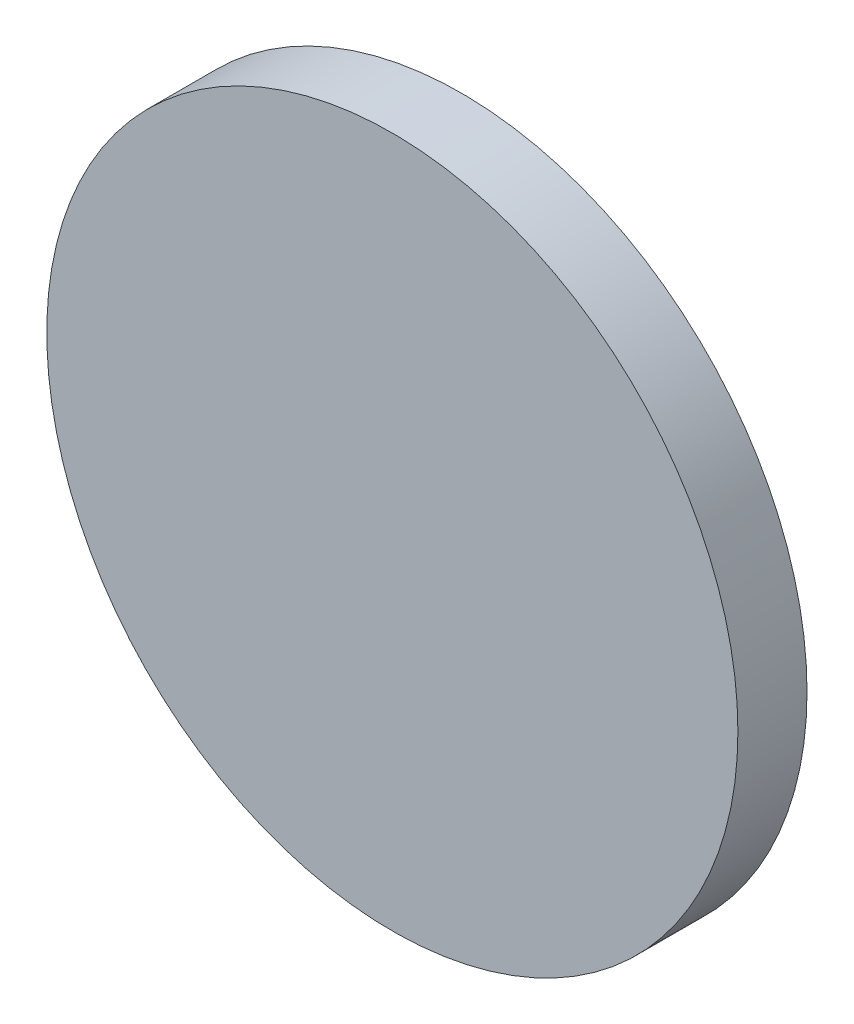
ISO-10303-21;
HEADER;
FILE_DESCRIPTION(('STEP AP214'),'2;1');
FILE_NAME('part.step','',(''),(''),'','','');
FILE_SCHEMA(('AUTOMOTIVE_DESIGN { 1 0 10303 214 1 1 1 1 }'));
ENDSEC;
DATA;
#1=APPLICATION_CONTEXT('core data for automotive mechanical design processes');
#2=APPLICATION_PROTOCOL_DEFINITION('international standard','automotive_design',2000,#1);
#3=PRODUCT_CONTEXT('',#1,'mechanical');
#4=PRODUCT('Part','Part','',(#3));
#5=PRODUCT_RELATED_PRODUCT_CATEGORY('part','',(#4));
#6=PRODUCT_DEFINITION_FORMATION('','',#4);
#7=PRODUCT_DEFINITION_CONTEXT('part definition',#1,'design');
#8=PRODUCT_DEFINITION('design','',#6,#7);
#9=PRODUCT_DEFINITION_SHAPE('','',#8);
#10=(LENGTH_UNIT() NAMED_UNIT(*) SI_UNIT(.MILLI.,.METRE.));
#11=(NAMED_UNIT(*) PLANE_ANGLE_UNIT() SI_UNIT($,.RADIAN.));
#12=(NAMED_UNIT(*) SI_UNIT($,.STERADIAN.) SOLID_ANGLE_UNIT());
#13=UNCERTAINTY_MEASURE_WITH_UNIT(LENGTH_MEASURE(1.E-05),#10,'distance_accuracy_value','');
#14=(GEOMETRIC_REPRESENTATION_CONTEXT(3) GLOBAL_UNCERTAINTY_ASSIGNED_CONTEXT((#13)) GLOBAL_UNIT_ASSIGNED_CONTEXT((#10,
#11,#12)) REPRESENTATION_CONTEXT('',''));
#15=CARTESIAN_POINT('',(0.,0.,0.));
#16=DIRECTION('',(0.,0.,1.));
#17=DIRECTION('',(1.,0.,0.));
#18=AXIS2_PLACEMENT_3D('',#15,#16,#17);
#19=CARTESIAN_POINT('',(-0.860205171589579,39.9907495186422,3.));
#20=DIRECTION('',(0.,0.,1.));
#21=DIRECTION('',(1.,0.,0.));
#22=AXIS2_PLACEMENT_3D('',#19,#20,#21);
#23=PLANE('',#22);
#24=CARTESIAN_POINT('',(-0.860205171589579,39.9907495186422,3.));
#25=DIRECTION('',(0.,0.,1.));
#26=DIRECTION('',(1.,0.,0.));
#27=AXIS2_PLACEMENT_3D('',#24,#25,#26);
#28=CIRCLE('',#27,15.);
#29=CARTESIAN_POINT('',(14.1397948284104,39.9907495186422,3.));
#30=VERTEX_POINT('',#29);
#31=EDGE_CURVE('E42',#30,#30,#28,.T.);
#32=ORIENTED_EDGE('',*,*,#31,.T.);
#33=EDGE_LOOP('',(#32));
#34=FACE_BOUND('',#33,.T.);
#35=ADVANCED_FACE('F35',(#34),#23,.T.);
#36=CARTESIAN_POINT('',(-0.860205171589579,39.9907495186422,0.));
#37=DIRECTION('',(0.,0.,1.));
#38=DIRECTION('',(1.,0.,0.));
#39=AXIS2_PLACEMENT_3D('',#36,#37,#38);
#40=PLANE('',#39);
#41=CARTESIAN_POINT('',(-0.860205171589579,39.9907495186422,0.));
#42=DIRECTION('',(0.,0.,1.));
#43=DIRECTION('',(1.,0.,0.));
#44=AXIS2_PLACEMENT_3D('',#41,#42,#43);
#45=CIRCLE('',#44,4.);
#46=CARTESIAN_POINT('',(3.13979482841042,39.9907495186422,0.));
#47=VERTEX_POINT('',#46);
#48=EDGE_CURVE('E10',#47,#47,#45,.F.);
#49=ORIENTED_EDGE('',*,*,#48,.F.);
#50=EDGE_LOOP('',(#49));
#51=FACE_BOUND('',#50,.T.);
#52=CARTESIAN_POINT('',(-0.860205171589579,39.9907495186422,0.));
#53=DIRECTION('',(0.,0.,1.));
#54=DIRECTION('',(1.,0.,0.));
#55=AXIS2_PLACEMENT_3D('',#52,#53,#54);
#56=CIRCLE('',#55,15.);
#57=CARTESIAN_POINT('',(14.1397948284104,39.9907495186422,0.));
#58=VERTEX_POINT('',#57);
#59=EDGE_CURVE('E46',#58,#58,#56,.T.);
#60=ORIENTED_EDGE('',*,*,#59,.F.);
#61=EDGE_LOOP('',(#60));
#62=FACE_BOUND('',#61,.T.);
#63=ADVANCED_FACE('F76',(#51,#62),#40,.F.);
#64=CARTESIAN_POINT('',(-0.860205171589579,39.9907495186422,3.));
#65=DIRECTION('',(0.,0.,-1.));
#66=DIRECTION('',(-1.,0.,0.));
#67=AXIS2_PLACEMENT_3D('',#64,#65,#66);
#68=CYLINDRICAL_SURFACE('',#67,15.);
#69=ORIENTED_EDGE('',*,*,#31,.F.);
#70=EDGE_LOOP('',(#69));
#71=FACE_BOUND('',#70,.T.);
#72=ORIENTED_EDGE('',*,*,#59,.T.);
#73=EDGE_LOOP('',(#72));
#74=FACE_BOUND('',#73,.T.);
#75=ADVANCED_FACE('F37',(#71,#74),#68,.T.);
#76=CARTESIAN_POINT('',(-0.860205171589579,39.9907495186422,-5.));
#77=DIRECTION('',(0.,0.,-1.));
#78=DIRECTION('',(-1.,0.,0.));
#79=AXIS2_PLACEMENT_3D('',#76,#77,#78);
#80=PLANE('',#79);
#81=CARTESIAN_POINT('',(-0.860205171589579,39.9907495186422,-5.));
#82=DIRECTION('',(0.,0.,-1.));
#83=DIRECTION('',(-1.,0.,0.));
#84=AXIS2_PLACEMENT_3D('',#81,#82,#83);
#85=CIRCLE('',#84,4.);
#86=CARTESIAN_POINT('',(-4.86020517158958,39.9907495186422,-5.));
#87=VERTEX_POINT('',#86);
#88=EDGE_CURVE('E51',#87,#87,#85,.T.);
#89=ORIENTED_EDGE('',*,*,#88,.T.);
#90=EDGE_LOOP('',(#89));
#91=FACE_BOUND('',#90,.T.);
#92=CARTESIAN_POINT('',(-0.860205171589579,39.9907495186422,-5.));
#93=DIRECTION('',(0.,0.,-1.));
#94=DIRECTION('',(-1.,0.,0.));
#95=AXIS2_PLACEMENT_3D('',#92,#93,#94);
#96=CIRCLE('',#95,3.5);
#97=CARTESIAN_POINT('',(-4.36020517158958,39.9907495186422,-5.));
#98=VERTEX_POINT('',#97);
#99=EDGE_CURVE('E55',#98,#98,#96,.T.);
#100=ORIENTED_EDGE('',*,*,#99,.F.);
#101=EDGE_LOOP('',(#100));
#102=FACE_BOUND('',#101,.T.);
#103=ADVANCED_FACE('F65',(#91,#102),#80,.T.);
#104=CARTESIAN_POINT('',(-0.860205171589579,39.9907495186422,-5.));
#105=DIRECTION('',(0.,0.,1.));
#106=DIRECTION('',(1.,0.,0.));
#107=AXIS2_PLACEMENT_3D('',#104,#105,#106);
#108=CYLINDRICAL_SURFACE('',#107,4.);
#109=ORIENTED_EDGE('',*,*,#88,.F.);
#110=EDGE_LOOP('',(#109));
#111=FACE_BOUND('',#110,.T.);
#112=ORIENTED_EDGE('',*,*,#48,.T.);
#113=EDGE_LOOP('',(#112));
#114=FACE_BOUND('',#113,.T.);
#115=ADVANCED_FACE('F67',(#111,#114),#108,.T.);
#116=CARTESIAN_POINT('',(-0.860205171589579,39.9907495186422,-5.));
#117=DIRECTION('',(0.,0.,1.));
#118=DIRECTION('',(1.,0.,0.));
#119=AXIS2_PLACEMENT_3D('',#116,#117,#118);
#120=CYLINDRICAL_SURFACE('',#119,3.5);
#121=ORIENTED_EDGE('',*,*,#99,.T.);
#122=EDGE_LOOP('',(#121));
#123=FACE_BOUND('',#122,.T.);
#124=CARTESIAN_POINT('',(-0.860205171589579,39.9907495186422,0.));
#125=DIRECTION('',(0.,0.,-1.));
#126=DIRECTION('',(-1.,0.,0.));
#127=AXIS2_PLACEMENT_3D('',#124,#125,#126);
#128=CIRCLE('',#127,3.5);
#129=CARTESIAN_POINT('',(-4.36020517158958,39.9907495186422,0.));
#130=VERTEX_POINT('',#129);
#131=EDGE_CURVE('E56',#130,#130,#128,.T.);
#132=ORIENTED_EDGE('',*,*,#131,.F.);
#133=EDGE_LOOP('',(#132));
#134=FACE_BOUND('',#133,.T.);
#135=ADVANCED_FACE('F62',(#123,#134),#120,.F.);
#136=ORIENTED_EDGE('',*,*,#131,.T.);
#137=EDGE_LOOP('',(#136));
#138=FACE_BOUND('',#137,.T.);
#139=ADVANCED_FACE('F85',(#138),#40,.F.);
#140=CLOSED_SHELL('',(#35,#63,#75,#103,#115,#135,#139));
#141=MANIFOLD_SOLID_BREP('B2',#140);
#142=ADVANCED_BREP_SHAPE_REPRESENTATION('',(#18,#141),#14);
#143=SHAPE_DEFINITION_REPRESENTATION(#9,#142);
ENDSEC;
END-ISO-10303-21;
